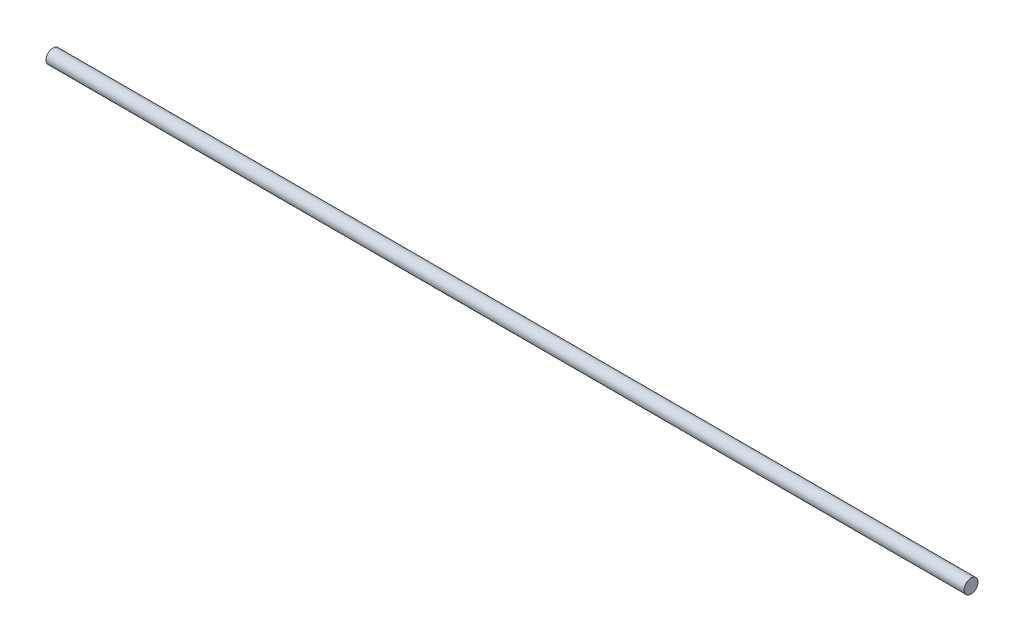
ISO-10303-21;
HEADER;
FILE_DESCRIPTION(('STEP AP214'),'2;1');
FILE_NAME('part.step','',(''),(''),'','','');
FILE_SCHEMA(('AUTOMOTIVE_DESIGN { 1 0 10303 214 1 1 1 1 }'));
ENDSEC;
DATA;
#1=APPLICATION_CONTEXT('core data for automotive mechanical design processes');
#2=APPLICATION_PROTOCOL_DEFINITION('international standard','automotive_design',2000,#1);
#3=PRODUCT_CONTEXT('',#1,'mechanical');
#4=PRODUCT('Part','Part','',(#3));
#5=PRODUCT_RELATED_PRODUCT_CATEGORY('part','',(#4));
#6=PRODUCT_DEFINITION_FORMATION('','',#4);
#7=PRODUCT_DEFINITION_CONTEXT('part definition',#1,'design');
#8=PRODUCT_DEFINITION('design','',#6,#7);
#9=PRODUCT_DEFINITION_SHAPE('','',#8);
#10=(LENGTH_UNIT() NAMED_UNIT(*) SI_UNIT(.MILLI.,.METRE.));
#11=(NAMED_UNIT(*) PLANE_ANGLE_UNIT() SI_UNIT($,.RADIAN.));
#12=(NAMED_UNIT(*) SI_UNIT($,.STERADIAN.) SOLID_ANGLE_UNIT());
#13=UNCERTAINTY_MEASURE_WITH_UNIT(LENGTH_MEASURE(1.E-05),#10,'distance_accuracy_value','');
#14=(GEOMETRIC_REPRESENTATION_CONTEXT(3) GLOBAL_UNCERTAINTY_ASSIGNED_CONTEXT((#13)) GLOBAL_UNIT_ASSIGNED_CONTEXT((#10,
#11,#12)) REPRESENTATION_CONTEXT('',''));
#15=CARTESIAN_POINT('',(0.,0.,0.));
#16=DIRECTION('',(0.,0.,1.));
#17=DIRECTION('',(1.,0.,0.));
#18=AXIS2_PLACEMENT_3D('',#15,#16,#17);
#19=CARTESIAN_POINT('',(501.65,0.,0.));
#20=DIRECTION('',(-1.,0.,0.));
#21=DIRECTION('',(0.,0.,1.));
#22=AXIS2_PLACEMENT_3D('',#19,#20,#21);
#23=CYLINDRICAL_SURFACE('',#22,3.8);
#24=CARTESIAN_POINT('',(501.65,0.,0.));
#25=DIRECTION('',(1.,0.,0.));
#26=DIRECTION('',(0.,0.,-1.));
#27=AXIS2_PLACEMENT_3D('',#24,#25,#26);
#28=CIRCLE('',#27,3.8);
#29=CARTESIAN_POINT('',(501.65,0.,-3.8));
#30=VERTEX_POINT('',#29);
#31=EDGE_CURVE('E10',#30,#30,#28,.T.);
#32=ORIENTED_EDGE('',*,*,#31,.F.);
#33=EDGE_LOOP('',(#32));
#34=FACE_BOUND('',#33,.T.);
#35=CARTESIAN_POINT('',(0.,0.,0.));
#36=DIRECTION('',(1.,0.,0.));
#37=DIRECTION('',(0.,0.,-1.));
#38=AXIS2_PLACEMENT_3D('',#35,#36,#37);
#39=CIRCLE('',#38,3.8);
#40=CARTESIAN_POINT('',(0.,0.,-3.8));
#41=VERTEX_POINT('',#40);
#42=EDGE_CURVE('E34',#41,#41,#39,.T.);
#43=ORIENTED_EDGE('',*,*,#42,.T.);
#44=EDGE_LOOP('',(#43));
#45=FACE_BOUND('',#44,.T.);
#46=ADVANCED_FACE('F31',(#34,#45),#23,.T.);
#47=CARTESIAN_POINT('',(501.65,0.,0.));
#48=DIRECTION('',(1.,0.,0.));
#49=DIRECTION('',(0.,0.,-1.));
#50=AXIS2_PLACEMENT_3D('',#47,#48,#49);
#51=PLANE('',#50);
#52=ORIENTED_EDGE('',*,*,#31,.T.);
#53=EDGE_LOOP('',(#52));
#54=FACE_BOUND('',#53,.T.);
#55=ADVANCED_FACE('F46',(#54),#51,.T.);
#56=CARTESIAN_POINT('',(0.,0.,0.));
#57=DIRECTION('',(1.,0.,0.));
#58=DIRECTION('',(0.,0.,-1.));
#59=AXIS2_PLACEMENT_3D('',#56,#57,#58);
#60=PLANE('',#59);
#61=ORIENTED_EDGE('',*,*,#42,.F.);
#62=EDGE_LOOP('',(#61));
#63=FACE_BOUND('',#62,.T.);
#64=ADVANCED_FACE('F44',(#63),#60,.F.);
#65=CLOSED_SHELL('',(#46,#55,#64));
#66=MANIFOLD_SOLID_BREP('B2',#65);
#67=ADVANCED_BREP_SHAPE_REPRESENTATION('',(#18,#66),#14);
#68=SHAPE_DEFINITION_REPRESENTATION(#9,#67);
ENDSEC;
END-ISO-10303-21;
